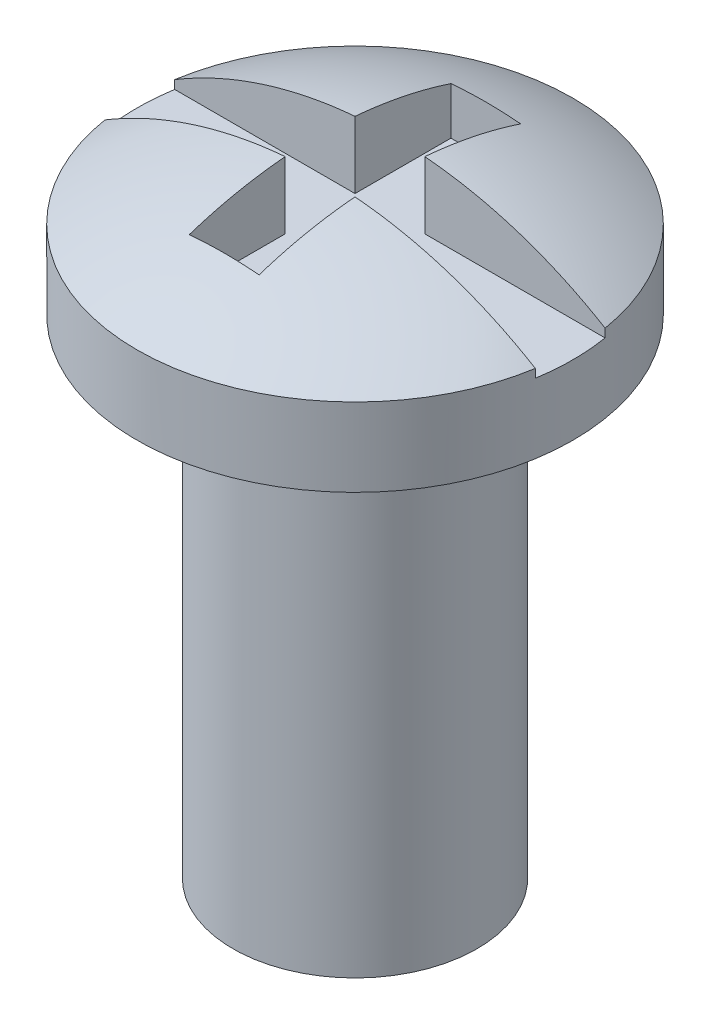
ISO-10303-21;
HEADER;
FILE_DESCRIPTION(('STEP AP214'),'2;1');
FILE_NAME('part.step','',(''),(''),'','','');
FILE_SCHEMA(('AUTOMOTIVE_DESIGN { 1 0 10303 214 1 1 1 1 }'));
ENDSEC;
DATA;
#1=APPLICATION_CONTEXT('core data for automotive mechanical design processes');
#2=APPLICATION_PROTOCOL_DEFINITION('international standard','automotive_design',2000,#1);
#3=PRODUCT_CONTEXT('',#1,'mechanical');
#4=PRODUCT('Part','Part','',(#3));
#5=PRODUCT_RELATED_PRODUCT_CATEGORY('part','',(#4));
#6=PRODUCT_DEFINITION_FORMATION('','',#4);
#7=PRODUCT_DEFINITION_CONTEXT('part definition',#1,'design');
#8=PRODUCT_DEFINITION('design','',#6,#7);
#9=PRODUCT_DEFINITION_SHAPE('','',#8);
#10=(LENGTH_UNIT() NAMED_UNIT(*) SI_UNIT(.MILLI.,.METRE.));
#11=(NAMED_UNIT(*) PLANE_ANGLE_UNIT() SI_UNIT($,.RADIAN.));
#12=(NAMED_UNIT(*) SI_UNIT($,.STERADIAN.) SOLID_ANGLE_UNIT());
#13=UNCERTAINTY_MEASURE_WITH_UNIT(LENGTH_MEASURE(1.E-05),#10,'distance_accuracy_value','');
#14=(GEOMETRIC_REPRESENTATION_CONTEXT(3) GLOBAL_UNCERTAINTY_ASSIGNED_CONTEXT((#13)) GLOBAL_UNIT_ASSIGNED_CONTEXT((#10,
#11,#12)) REPRESENTATION_CONTEXT('',''));
#15=CARTESIAN_POINT('',(0.,0.,0.));
#16=DIRECTION('',(0.,0.,1.));
#17=DIRECTION('',(1.,0.,0.));
#18=AXIS2_PLACEMENT_3D('',#15,#16,#17);
#19=CARTESIAN_POINT('',(-3.50234861591695,8.,0.5));
#20=DIRECTION('',(0.,0.,1.));
#21=DIRECTION('',(-1.,0.,0.));
#22=AXIS2_PLACEMENT_3D('',#19,#20,#21);
#23=PLANE('',#22);
#24=CARTESIAN_POINT('',(0.,3.,0.5));
#25=DIRECTION('',(0.,0.,-1.));
#26=DIRECTION('',(-1.,0.,0.));
#27=AXIS2_PLACEMENT_3D('',#24,#25,#26);
#28=CIRCLE('',#27,5.9791303715507);
#29=CARTESIAN_POINT('',(-3.08474066981327,8.12195031213697,0.5));
#30=VERTEX_POINT('',#29);
#31=CARTESIAN_POINT('',(-0.5,8.95818764390649,0.5));
#32=VERTEX_POINT('',#31);
#33=EDGE_CURVE('E147',#30,#32,#28,.T.);
#34=ORIENTED_EDGE('',*,*,#33,.T.);
#35=DIRECTION('',(0.,1.,0.));
#36=VECTOR('',#35,1.);
#37=CARTESIAN_POINT('',(-0.5,8.,0.5));
#38=LINE('',#37,#36);
#39=CARTESIAN_POINT('',(-0.5,8.,0.5));
#40=VERTEX_POINT('',#39);
#41=EDGE_CURVE('E179',#40,#32,#38,.T.);
#42=ORIENTED_EDGE('',*,*,#41,.F.);
#43=DIRECTION('',(-1.,0.,0.));
#44=VECTOR('',#43,1.);
#45=CARTESIAN_POINT('',(-3.50234861591695,8.,0.5));
#46=LINE('',#45,#44);
#47=CARTESIAN_POINT('',(-3.08474066981327,8.,0.5));
#48=VERTEX_POINT('',#47);
#49=EDGE_CURVE('E186',#40,#48,#46,.T.);
#50=ORIENTED_EDGE('',*,*,#49,.T.);
#51=DIRECTION('',(0.,-1.,0.));
#52=VECTOR('',#51,1.);
#53=CARTESIAN_POINT('',(-3.08474066981327,9.,0.5));
#54=LINE('',#53,#52);
#55=EDGE_CURVE('E196',#48,#30,#54,.F.);
#56=ORIENTED_EDGE('',*,*,#55,.T.);
#57=EDGE_LOOP('',(#34,#42,#50,#56));
#58=FACE_BOUND('',#57,.T.);
#59=ADVANCED_FACE('F34',(#58),#23,.F.);
#60=CARTESIAN_POINT('',(-3.50234861591695,8.,-0.5));
#61=DIRECTION('',(0.,0.,-1.));
#62=DIRECTION('',(1.,0.,0.));
#63=AXIS2_PLACEMENT_3D('',#60,#61,#62);
#64=PLANE('',#63);
#65=CARTESIAN_POINT('',(0.,3.,-0.5));
#66=DIRECTION('',(0.,0.,1.));
#67=DIRECTION('',(1.,0.,0.));
#68=AXIS2_PLACEMENT_3D('',#65,#66,#67);
#69=CIRCLE('',#68,5.9791303715507);
#70=CARTESIAN_POINT('',(-0.499999999999999,8.95818764390649,-0.5));
#71=VERTEX_POINT('',#70);
#72=CARTESIAN_POINT('',(-3.08474066981327,8.12195031213697,-0.5));
#73=VERTEX_POINT('',#72);
#74=EDGE_CURVE('E160',#71,#73,#69,.T.);
#75=ORIENTED_EDGE('',*,*,#74,.T.);
#76=DIRECTION('',(0.,-1.,0.));
#77=VECTOR('',#76,1.);
#78=CARTESIAN_POINT('',(-3.08474066981327,9.,-0.5));
#79=LINE('',#78,#77);
#80=CARTESIAN_POINT('',(-3.08474066981327,8.,-0.5));
#81=VERTEX_POINT('',#80);
#82=EDGE_CURVE('E193',#73,#81,#79,.T.);
#83=ORIENTED_EDGE('',*,*,#82,.T.);
#84=DIRECTION('',(1.,0.,0.));
#85=VECTOR('',#84,1.);
#86=CARTESIAN_POINT('',(-3.50234861591695,8.,-0.5));
#87=LINE('',#86,#85);
#88=CARTESIAN_POINT('',(-0.499999999999999,8.,-0.5));
#89=VERTEX_POINT('',#88);
#90=EDGE_CURVE('E183',#81,#89,#87,.T.);
#91=ORIENTED_EDGE('',*,*,#90,.T.);
#92=DIRECTION('',(0.,-1.,0.));
#93=VECTOR('',#92,1.);
#94=CARTESIAN_POINT('',(-0.5,8.,-0.5));
#95=LINE('',#94,#93);
#96=EDGE_CURVE('E42',#71,#89,#95,.T.);
#97=ORIENTED_EDGE('',*,*,#96,.F.);
#98=EDGE_LOOP('',(#75,#83,#91,#97));
#99=FACE_BOUND('',#98,.T.);
#100=ADVANCED_FACE('F224',(#99),#64,.F.);
#101=CARTESIAN_POINT('',(0.,9.,0.));
#102=DIRECTION('',(0.,-1.,0.));
#103=DIRECTION('',(0.,0.,1.));
#104=AXIS2_PLACEMENT_3D('',#101,#102,#103);
#105=CYLINDRICAL_SURFACE('',#104,3.125);
#106=CARTESIAN_POINT('',(0.,7.,0.));
#107=DIRECTION('',(0.,-1.,0.));
#108=DIRECTION('',(0.,0.,-1.));
#109=AXIS2_PLACEMENT_3D('',#106,#107,#108);
#110=CIRCLE('',#109,3.125);
#111=CARTESIAN_POINT('',(0.,7.,-3.125));
#112=VERTEX_POINT('',#111);
#113=EDGE_CURVE('E202',#112,#112,#110,.T.);
#114=ORIENTED_EDGE('',*,*,#113,.F.);
#115=EDGE_LOOP('',(#114));
#116=FACE_BOUND('',#115,.T.);
#117=CARTESIAN_POINT('',(0.,8.12195031213697,0.));
#118=DIRECTION('',(0.,1.,0.));
#119=DIRECTION('',(0.,0.,1.));
#120=AXIS2_PLACEMENT_3D('',#117,#118,#119);
#121=CIRCLE('',#120,3.125);
#122=CARTESIAN_POINT('',(3.08474066981327,8.12195031213697,-0.5));
#123=VERTEX_POINT('',#122);
#124=EDGE_CURVE('E148',#73,#123,#121,.F.);
#125=ORIENTED_EDGE('',*,*,#124,.T.);
#126=DIRECTION('',(0.,-1.,0.));
#127=VECTOR('',#126,1.);
#128=CARTESIAN_POINT('',(3.08474066981327,9.,-0.5));
#129=LINE('',#128,#127);
#130=CARTESIAN_POINT('',(3.08474066981327,8.,-0.5));
#131=VERTEX_POINT('',#130);
#132=EDGE_CURVE('E190',#131,#123,#129,.F.);
#133=ORIENTED_EDGE('',*,*,#132,.F.);
#134=CARTESIAN_POINT('',(0.,8.,0.));
#135=DIRECTION('',(0.,-1.,0.));
#136=DIRECTION('',(0.,0.,-1.));
#137=AXIS2_PLACEMENT_3D('',#134,#135,#136);
#138=CIRCLE('',#137,3.125);
#139=CARTESIAN_POINT('',(3.08474066981327,8.,0.5));
#140=VERTEX_POINT('',#139);
#141=EDGE_CURVE('E213',#131,#140,#138,.T.);
#142=ORIENTED_EDGE('',*,*,#141,.T.);
#143=DIRECTION('',(0.,-1.,0.));
#144=VECTOR('',#143,1.);
#145=CARTESIAN_POINT('',(3.08474066981327,9.,0.5));
#146=LINE('',#145,#144);
#147=CARTESIAN_POINT('',(3.08474066981327,8.12195031213697,0.5));
#148=VERTEX_POINT('',#147);
#149=EDGE_CURVE('E199',#148,#140,#146,.T.);
#150=ORIENTED_EDGE('',*,*,#149,.F.);
#151=EDGE_CURVE('E145',#148,#30,#121,.F.);
#152=ORIENTED_EDGE('',*,*,#151,.T.);
#153=ORIENTED_EDGE('',*,*,#55,.F.);
#154=EDGE_CURVE('E209',#48,#81,#138,.T.);
#155=ORIENTED_EDGE('',*,*,#154,.T.);
#156=ORIENTED_EDGE('',*,*,#82,.F.);
#157=EDGE_LOOP('',(#125,#133,#142,#150,#152,#153,#155,#156));
#158=FACE_BOUND('',#157,.T.);
#159=ADVANCED_FACE('F240',(#116,#158),#105,.T.);
#160=CARTESIAN_POINT('',(0.,3.,0.5));
#161=DIRECTION('',(0.,0.,-1.));
#162=DIRECTION('',(-1.,0.,0.));
#163=AXIS2_PLACEMENT_3D('',#160,#161,#162);
#164=CIRCLE('',#163,5.9791303715507);
#165=CARTESIAN_POINT('',(0.5,8.95818764390649,0.5));
#166=VERTEX_POINT('',#165);
#167=EDGE_CURVE('E139',#166,#148,#164,.T.);
#168=ORIENTED_EDGE('',*,*,#167,.T.);
#169=ORIENTED_EDGE('',*,*,#149,.T.);
#170=CARTESIAN_POINT('',(0.5,8.,0.5));
#171=VERTEX_POINT('',#170);
#172=EDGE_CURVE('E187',#140,#171,#46,.T.);
#173=ORIENTED_EDGE('',*,*,#172,.T.);
#174=DIRECTION('',(0.,-1.,0.));
#175=VECTOR('',#174,1.);
#176=CARTESIAN_POINT('',(0.5,8.,0.5));
#177=LINE('',#176,#175);
#178=EDGE_CURVE('E173',#166,#171,#177,.T.);
#179=ORIENTED_EDGE('',*,*,#178,.F.);
#180=EDGE_LOOP('',(#168,#169,#173,#179));
#181=FACE_BOUND('',#180,.T.);
#182=ADVANCED_FACE('F251',(#181),#23,.F.);
#183=CARTESIAN_POINT('',(0.,3.,-0.5));
#184=DIRECTION('',(0.,0.,1.));
#185=DIRECTION('',(1.,0.,0.));
#186=AXIS2_PLACEMENT_3D('',#183,#184,#185);
#187=CIRCLE('',#186,5.9791303715507);
#188=CARTESIAN_POINT('',(0.5,8.95818764390649,-0.5));
#189=VERTEX_POINT('',#188);
#190=EDGE_CURVE('E157',#123,#189,#187,.T.);
#191=ORIENTED_EDGE('',*,*,#190,.T.);
#192=DIRECTION('',(0.,1.,0.));
#193=VECTOR('',#192,1.);
#194=CARTESIAN_POINT('',(0.5,8.,-0.5));
#195=LINE('',#194,#193);
#196=CARTESIAN_POINT('',(0.5,8.,-0.5));
#197=VERTEX_POINT('',#196);
#198=EDGE_CURVE('E214',#197,#189,#195,.T.);
#199=ORIENTED_EDGE('',*,*,#198,.F.);
#200=EDGE_CURVE('E182',#197,#131,#87,.T.);
#201=ORIENTED_EDGE('',*,*,#200,.T.);
#202=ORIENTED_EDGE('',*,*,#132,.T.);
#203=EDGE_LOOP('',(#191,#199,#201,#202));
#204=FACE_BOUND('',#203,.T.);
#205=ADVANCED_FACE('F254',(#204),#64,.F.);
#206=CARTESIAN_POINT('',(0.5,8.,1.875));
#207=DIRECTION('',(1.,0.,0.));
#208=DIRECTION('',(0.,0.,1.));
#209=AXIS2_PLACEMENT_3D('',#206,#207,#208);
#210=PLANE('',#209);
#211=CARTESIAN_POINT('',(0.5,3.,0.));
#212=DIRECTION('',(-1.,0.,0.));
#213=DIRECTION('',(0.,0.,1.));
#214=AXIS2_PLACEMENT_3D('',#211,#212,#213);
#215=CIRCLE('',#214,5.9791303715507);
#216=CARTESIAN_POINT('',(0.499999999999999,8.67753247458788,-1.875));
#217=VERTEX_POINT('',#216);
#218=EDGE_CURVE('E154',#189,#217,#215,.T.);
#219=ORIENTED_EDGE('',*,*,#218,.T.);
#220=DIRECTION('',(0.,1.,0.));
#221=VECTOR('',#220,1.);
#222=CARTESIAN_POINT('',(0.499999999999999,8.,-1.875));
#223=LINE('',#222,#221);
#224=CARTESIAN_POINT('',(0.499999999999999,8.,-1.875));
#225=VERTEX_POINT('',#224);
#226=EDGE_CURVE('E133',#225,#217,#223,.T.);
#227=ORIENTED_EDGE('',*,*,#226,.F.);
#228=DIRECTION('',(0.,0.,1.));
#229=VECTOR('',#228,1.);
#230=CARTESIAN_POINT('',(0.5,8.,1.875));
#231=LINE('',#230,#229);
#232=EDGE_CURVE('E168',#225,#197,#231,.T.);
#233=ORIENTED_EDGE('',*,*,#232,.T.);
#234=ORIENTED_EDGE('',*,*,#198,.T.);
#235=EDGE_LOOP('',(#219,#227,#233,#234));
#236=FACE_BOUND('',#235,.T.);
#237=ADVANCED_FACE('F256',(#236),#210,.F.);
#238=CARTESIAN_POINT('',(-0.5,8.,1.875));
#239=DIRECTION('',(-1.,0.,0.));
#240=DIRECTION('',(0.,0.,-1.));
#241=AXIS2_PLACEMENT_3D('',#238,#239,#240);
#242=PLANE('',#241);
#243=CARTESIAN_POINT('',(-0.5,3.,0.));
#244=DIRECTION('',(1.,0.,0.));
#245=DIRECTION('',(0.,0.,-1.));
#246=AXIS2_PLACEMENT_3D('',#243,#244,#245);
#247=CIRCLE('',#246,5.9791303715507);
#248=CARTESIAN_POINT('',(-0.499999999999999,8.67753247458788,-1.875));
#249=VERTEX_POINT('',#248);
#250=EDGE_CURVE('E152',#249,#71,#247,.T.);
#251=ORIENTED_EDGE('',*,*,#250,.T.);
#252=ORIENTED_EDGE('',*,*,#96,.T.);
#253=DIRECTION('',(0.,0.,-1.));
#254=VECTOR('',#253,1.);
#255=CARTESIAN_POINT('',(-0.5,8.,1.875));
#256=LINE('',#255,#254);
#257=CARTESIAN_POINT('',(-0.499999999999999,8.,-1.875));
#258=VERTEX_POINT('',#257);
#259=EDGE_CURVE('E163',#89,#258,#256,.T.);
#260=ORIENTED_EDGE('',*,*,#259,.T.);
#261=DIRECTION('',(0.,1.,0.));
#262=VECTOR('',#261,1.);
#263=CARTESIAN_POINT('',(-0.499999999999999,8.,-1.875));
#264=LINE('',#263,#262);
#265=EDGE_CURVE('E172',#258,#249,#264,.T.);
#266=ORIENTED_EDGE('',*,*,#265,.T.);
#267=EDGE_LOOP('',(#251,#252,#260,#266));
#268=FACE_BOUND('',#267,.T.);
#269=ADVANCED_FACE('F220',(#268),#242,.F.);
#270=CARTESIAN_POINT('',(-0.499999999999999,8.,-1.875));
#271=DIRECTION('',(0.,0.,-1.));
#272=DIRECTION('',(1.,0.,0.));
#273=AXIS2_PLACEMENT_3D('',#270,#271,#272);
#274=PLANE('',#273);
#275=CARTESIAN_POINT('',(0.,3.,-1.875));
#276=DIRECTION('',(0.,0.,1.));
#277=DIRECTION('',(1.,0.,0.));
#278=AXIS2_PLACEMENT_3D('',#275,#276,#277);
#279=CIRCLE('',#278,5.699506557589);
#280=EDGE_CURVE('E49',#217,#249,#279,.T.);
#281=ORIENTED_EDGE('',*,*,#280,.T.);
#282=ORIENTED_EDGE('',*,*,#265,.F.);
#283=DIRECTION('',(1.,0.,0.));
#284=VECTOR('',#283,1.);
#285=CARTESIAN_POINT('',(-0.499999999999999,8.,-1.875));
#286=LINE('',#285,#284);
#287=EDGE_CURVE('E166',#258,#225,#286,.T.);
#288=ORIENTED_EDGE('',*,*,#287,.T.);
#289=ORIENTED_EDGE('',*,*,#226,.T.);
#290=EDGE_LOOP('',(#281,#282,#288,#289));
#291=FACE_BOUND('',#290,.T.);
#292=ADVANCED_FACE('F235',(#291),#274,.F.);
#293=CARTESIAN_POINT('',(-0.5,3.,0.));
#294=DIRECTION('',(1.,0.,0.));
#295=DIRECTION('',(0.,0.,-1.));
#296=AXIS2_PLACEMENT_3D('',#293,#294,#295);
#297=CIRCLE('',#296,5.9791303715507);
#298=CARTESIAN_POINT('',(-0.5,8.67753247458788,1.875));
#299=VERTEX_POINT('',#298);
#300=EDGE_CURVE('E140',#32,#299,#297,.T.);
#301=ORIENTED_EDGE('',*,*,#300,.T.);
#302=DIRECTION('',(0.,1.,0.));
#303=VECTOR('',#302,1.);
#304=CARTESIAN_POINT('',(-0.5,8.,1.875));
#305=LINE('',#304,#303);
#306=CARTESIAN_POINT('',(-0.5,8.,1.875));
#307=VERTEX_POINT('',#306);
#308=EDGE_CURVE('E125',#307,#299,#305,.T.);
#309=ORIENTED_EDGE('',*,*,#308,.F.);
#310=EDGE_CURVE('E164',#307,#40,#256,.T.);
#311=ORIENTED_EDGE('',*,*,#310,.T.);
#312=ORIENTED_EDGE('',*,*,#41,.T.);
#313=EDGE_LOOP('',(#301,#309,#311,#312));
#314=FACE_BOUND('',#313,.T.);
#315=ADVANCED_FACE('F247',(#314),#242,.F.);
#316=CARTESIAN_POINT('',(0.5,3.,0.));
#317=DIRECTION('',(-1.,0.,0.));
#318=DIRECTION('',(0.,0.,1.));
#319=AXIS2_PLACEMENT_3D('',#316,#317,#318);
#320=CIRCLE('',#319,5.9791303715507);
#321=CARTESIAN_POINT('',(0.5,8.67753247458788,1.875));
#322=VERTEX_POINT('',#321);
#323=EDGE_CURVE('E130',#322,#166,#320,.T.);
#324=ORIENTED_EDGE('',*,*,#323,.T.);
#325=ORIENTED_EDGE('',*,*,#178,.T.);
#326=CARTESIAN_POINT('',(0.5,8.,1.875));
#327=VERTEX_POINT('',#326);
#328=EDGE_CURVE('E132',#171,#327,#231,.T.);
#329=ORIENTED_EDGE('',*,*,#328,.T.);
#330=DIRECTION('',(0.,1.,0.));
#331=VECTOR('',#330,1.);
#332=CARTESIAN_POINT('',(0.5,8.,1.875));
#333=LINE('',#332,#331);
#334=EDGE_CURVE('E122',#327,#322,#333,.T.);
#335=ORIENTED_EDGE('',*,*,#334,.T.);
#336=EDGE_LOOP('',(#324,#325,#329,#335));
#337=FACE_BOUND('',#336,.T.);
#338=ADVANCED_FACE('F128',(#337),#210,.F.);
#339=CARTESIAN_POINT('',(-0.5,8.,1.875));
#340=DIRECTION('',(0.,0.,1.));
#341=DIRECTION('',(-1.,0.,0.));
#342=AXIS2_PLACEMENT_3D('',#339,#340,#341);
#343=PLANE('',#342);
#344=CARTESIAN_POINT('',(0.,3.,1.875));
#345=DIRECTION('',(0.,0.,-1.));
#346=DIRECTION('',(-1.,0.,0.));
#347=AXIS2_PLACEMENT_3D('',#344,#345,#346);
#348=CIRCLE('',#347,5.699506557589);
#349=EDGE_CURVE('E11',#299,#322,#348,.T.);
#350=ORIENTED_EDGE('',*,*,#349,.T.);
#351=ORIENTED_EDGE('',*,*,#334,.F.);
#352=DIRECTION('',(-1.,0.,0.));
#353=VECTOR('',#352,1.);
#354=CARTESIAN_POINT('',(-0.5,8.,1.875));
#355=LINE('',#354,#353);
#356=EDGE_CURVE('E170',#327,#307,#355,.T.);
#357=ORIENTED_EDGE('',*,*,#356,.T.);
#358=ORIENTED_EDGE('',*,*,#308,.T.);
#359=EDGE_LOOP('',(#350,#351,#357,#358));
#360=FACE_BOUND('',#359,.T.);
#361=ADVANCED_FACE('F121',(#360),#343,.F.);
#362=CARTESIAN_POINT('',(0.,7.,0.));
#363=DIRECTION('',(0.,-1.,0.));
#364=DIRECTION('',(0.,0.,1.));
#365=AXIS2_PLACEMENT_3D('',#362,#363,#364);
#366=CYLINDRICAL_SURFACE('',#365,1.75);
#367=CARTESIAN_POINT('',(0.,7.,0.));
#368=DIRECTION('',(0.,-1.,0.));
#369=DIRECTION('',(0.,0.,-1.));
#370=AXIS2_PLACEMENT_3D('',#367,#368,#369);
#371=CIRCLE('',#370,1.75);
#372=CARTESIAN_POINT('',(0.,7.,-1.75));
#373=VERTEX_POINT('',#372);
#374=EDGE_CURVE('E206',#373,#373,#371,.T.);
#375=ORIENTED_EDGE('',*,*,#374,.T.);
#376=EDGE_LOOP('',(#375));
#377=FACE_BOUND('',#376,.T.);
#378=CARTESIAN_POINT('',(0.,0.,0.));
#379=DIRECTION('',(0.,-1.,0.));
#380=DIRECTION('',(0.,0.,-1.));
#381=AXIS2_PLACEMENT_3D('',#378,#379,#380);
#382=CIRCLE('',#381,1.75);
#383=CARTESIAN_POINT('',(0.,0.,-1.75));
#384=VERTEX_POINT('',#383);
#385=EDGE_CURVE('E205',#384,#384,#382,.T.);
#386=ORIENTED_EDGE('',*,*,#385,.F.);
#387=EDGE_LOOP('',(#386));
#388=FACE_BOUND('',#387,.T.);
#389=ADVANCED_FACE('F36',(#377,#388),#366,.T.);
#390=CARTESIAN_POINT('',(0.,0.,0.));
#391=DIRECTION('',(0.,1.,0.));
#392=DIRECTION('',(0.,0.,-1.));
#393=AXIS2_PLACEMENT_3D('',#390,#391,#392);
#394=PLANE('',#393);
#395=ORIENTED_EDGE('',*,*,#385,.T.);
#396=EDGE_LOOP('',(#395));
#397=FACE_BOUND('',#396,.T.);
#398=ADVANCED_FACE('F285',(#397),#394,.F.);
#399=CARTESIAN_POINT('',(0.,7.,0.));
#400=DIRECTION('',(0.,1.,0.));
#401=DIRECTION('',(0.,0.,-1.));
#402=AXIS2_PLACEMENT_3D('',#399,#400,#401);
#403=PLANE('',#402);
#404=ORIENTED_EDGE('',*,*,#113,.T.);
#405=EDGE_LOOP('',(#404));
#406=FACE_BOUND('',#405,.T.);
#407=ORIENTED_EDGE('',*,*,#374,.F.);
#408=EDGE_LOOP('',(#407));
#409=FACE_BOUND('',#408,.T.);
#410=ADVANCED_FACE('F284',(#406,#409),#403,.F.);
#411=CARTESIAN_POINT('',(-3.50234861591695,8.,-0.5));
#412=DIRECTION('',(0.,1.,0.));
#413=DIRECTION('',(0.,0.,-1.));
#414=AXIS2_PLACEMENT_3D('',#411,#412,#413);
#415=PLANE('',#414);
#416=ORIENTED_EDGE('',*,*,#172,.F.);
#417=ORIENTED_EDGE('',*,*,#141,.F.);
#418=ORIENTED_EDGE('',*,*,#200,.F.);
#419=ORIENTED_EDGE('',*,*,#232,.F.);
#420=ORIENTED_EDGE('',*,*,#287,.F.);
#421=ORIENTED_EDGE('',*,*,#259,.F.);
#422=ORIENTED_EDGE('',*,*,#90,.F.);
#423=ORIENTED_EDGE('',*,*,#154,.F.);
#424=ORIENTED_EDGE('',*,*,#49,.F.);
#425=ORIENTED_EDGE('',*,*,#310,.F.);
#426=ORIENTED_EDGE('',*,*,#356,.F.);
#427=ORIENTED_EDGE('',*,*,#328,.F.);
#428=EDGE_LOOP('',(#416,#417,#418,#419,#420,#421,#422,#423,#424,#425,#426,#427));
#429=FACE_BOUND('',#428,.T.);
#430=ADVANCED_FACE('F227',(#429),#415,.T.);
#431=CARTESIAN_POINT('',(0.,3.,0.));
#432=DIRECTION('',(0.,-1.,0.));
#433=DIRECTION('',(0.,0.,-1.));
#434=AXIS2_PLACEMENT_3D('',#431,#432,#433);
#435=SPHERICAL_SURFACE('',#434,6.);
#436=ORIENTED_EDGE('',*,*,#33,.F.);
#437=ORIENTED_EDGE('',*,*,#151,.F.);
#438=ORIENTED_EDGE('',*,*,#167,.F.);
#439=ORIENTED_EDGE('',*,*,#323,.F.);
#440=ORIENTED_EDGE('',*,*,#349,.F.);
#441=ORIENTED_EDGE('',*,*,#300,.F.);
#442=EDGE_LOOP('',(#436,#437,#438,#439,#440,#441));
#443=FACE_BOUND('',#442,.T.);
#444=ADVANCED_FACE('F137',(#443),#435,.T.);
#445=ORIENTED_EDGE('',*,*,#74,.F.);
#446=ORIENTED_EDGE('',*,*,#250,.F.);
#447=ORIENTED_EDGE('',*,*,#280,.F.);
#448=ORIENTED_EDGE('',*,*,#218,.F.);
#449=ORIENTED_EDGE('',*,*,#190,.F.);
#450=ORIENTED_EDGE('',*,*,#124,.F.);
#451=EDGE_LOOP('',(#445,#446,#447,#448,#449,#450));
#452=FACE_BOUND('',#451,.T.);
#453=ADVANCED_FACE('F236',(#452),#435,.T.);
#454=CLOSED_SHELL('',(#59,#100,#159,#182,#205,#237,#269,#292,#315,#338,#361,#389,#398,#410,#430,
#444,#453));
#455=MANIFOLD_SOLID_BREP('B2',#454);
#456=ADVANCED_BREP_SHAPE_REPRESENTATION('',(#18,#455),#14);
#457=SHAPE_DEFINITION_REPRESENTATION(#9,#456);
ENDSEC;
END-ISO-10303-21;
